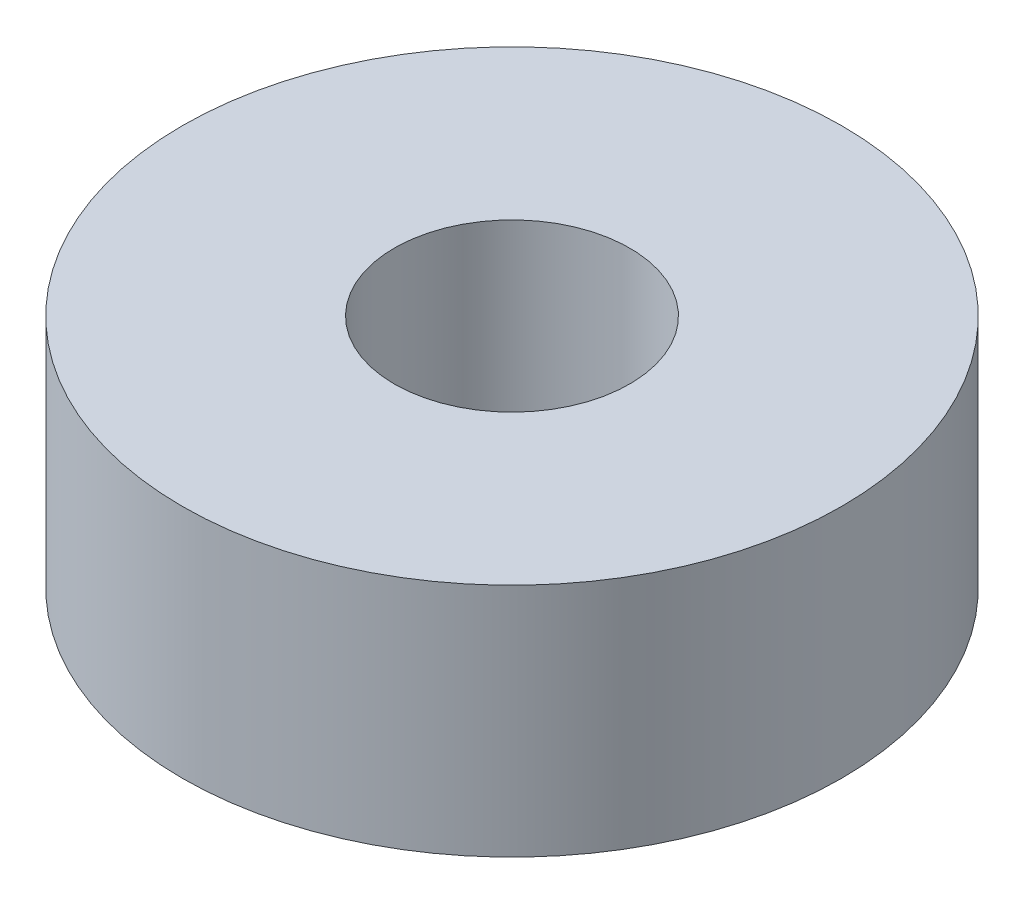
ISO-10303-21;
HEADER;
FILE_DESCRIPTION(('STEP AP214'),'2;1');
FILE_NAME('part.step','',(''),(''),'','','');
FILE_SCHEMA(('AUTOMOTIVE_DESIGN { 1 0 10303 214 1 1 1 1 }'));
ENDSEC;
DATA;
#1=APPLICATION_CONTEXT('core data for automotive mechanical design processes');
#2=APPLICATION_PROTOCOL_DEFINITION('international standard','automotive_design',2000,#1);
#3=PRODUCT_CONTEXT('',#1,'mechanical');
#4=PRODUCT('Part','Part','',(#3));
#5=PRODUCT_RELATED_PRODUCT_CATEGORY('part','',(#4));
#6=PRODUCT_DEFINITION_FORMATION('','',#4);
#7=PRODUCT_DEFINITION_CONTEXT('part definition',#1,'design');
#8=PRODUCT_DEFINITION('design','',#6,#7);
#9=PRODUCT_DEFINITION_SHAPE('','',#8);
#10=(LENGTH_UNIT() NAMED_UNIT(*) SI_UNIT(.MILLI.,.METRE.));
#11=(NAMED_UNIT(*) PLANE_ANGLE_UNIT() SI_UNIT($,.RADIAN.));
#12=(NAMED_UNIT(*) SI_UNIT($,.STERADIAN.) SOLID_ANGLE_UNIT());
#13=UNCERTAINTY_MEASURE_WITH_UNIT(LENGTH_MEASURE(1.E-05),#10,'distance_accuracy_value','');
#14=(GEOMETRIC_REPRESENTATION_CONTEXT(3) GLOBAL_UNCERTAINTY_ASSIGNED_CONTEXT((#13)) GLOBAL_UNIT_ASSIGNED_CONTEXT((#10,
#11,#12)) REPRESENTATION_CONTEXT('',''));
#15=CARTESIAN_POINT('',(0.,0.,0.));
#16=DIRECTION('',(0.,0.,1.));
#17=DIRECTION('',(1.,0.,0.));
#18=AXIS2_PLACEMENT_3D('',#15,#16,#17);
#19=CARTESIAN_POINT('',(0.,5.,0.));
#20=DIRECTION('',(0.,1.,0.));
#21=DIRECTION('',(0.,0.,1.));
#22=AXIS2_PLACEMENT_3D('',#19,#20,#21);
#23=PLANE('',#22);
#24=CARTESIAN_POINT('',(0.,5.,0.));
#25=DIRECTION('',(0.,1.,0.));
#26=DIRECTION('',(0.,0.,1.));
#27=AXIS2_PLACEMENT_3D('',#24,#25,#26);
#28=CIRCLE('',#27,7.);
#29=CARTESIAN_POINT('',(0.,5.,7.));
#30=VERTEX_POINT('',#29);
#31=EDGE_CURVE('E10',#30,#30,#28,.T.);
#32=ORIENTED_EDGE('',*,*,#31,.T.);
#33=EDGE_LOOP('',(#32));
#34=FACE_BOUND('',#33,.T.);
#35=CARTESIAN_POINT('',(0.,5.,0.));
#36=DIRECTION('',(0.,1.,0.));
#37=DIRECTION('',(0.,0.,1.));
#38=AXIS2_PLACEMENT_3D('',#35,#36,#37);
#39=CIRCLE('',#38,2.5);
#40=CARTESIAN_POINT('',(0.,5.,2.5));
#41=VERTEX_POINT('',#40);
#42=EDGE_CURVE('E50',#41,#41,#39,.T.);
#43=ORIENTED_EDGE('',*,*,#42,.F.);
#44=EDGE_LOOP('',(#43));
#45=FACE_BOUND('',#44,.T.);
#46=ADVANCED_FACE('F37',(#34,#45),#23,.T.);
#47=CARTESIAN_POINT('',(0.,0.,0.));
#48=DIRECTION('',(0.,1.,0.));
#49=DIRECTION('',(0.,0.,1.));
#50=AXIS2_PLACEMENT_3D('',#47,#48,#49);
#51=PLANE('',#50);
#52=CARTESIAN_POINT('',(0.,0.,0.));
#53=DIRECTION('',(0.,1.,0.));
#54=DIRECTION('',(0.,0.,1.));
#55=AXIS2_PLACEMENT_3D('',#52,#53,#54);
#56=CIRCLE('',#55,7.);
#57=CARTESIAN_POINT('',(0.,0.,7.));
#58=VERTEX_POINT('',#57);
#59=EDGE_CURVE('E41',#58,#58,#56,.T.);
#60=ORIENTED_EDGE('',*,*,#59,.F.);
#61=EDGE_LOOP('',(#60));
#62=FACE_BOUND('',#61,.T.);
#63=CARTESIAN_POINT('',(0.,0.,0.));
#64=DIRECTION('',(0.,1.,0.));
#65=DIRECTION('',(0.,0.,1.));
#66=AXIS2_PLACEMENT_3D('',#63,#64,#65);
#67=CIRCLE('',#66,2.5);
#68=CARTESIAN_POINT('',(0.,0.,2.5));
#69=VERTEX_POINT('',#68);
#70=EDGE_CURVE('E52',#69,#69,#67,.T.);
#71=ORIENTED_EDGE('',*,*,#70,.T.);
#72=EDGE_LOOP('',(#71));
#73=FACE_BOUND('',#72,.T.);
#74=ADVANCED_FACE('F64',(#62,#73),#51,.F.);
#75=CARTESIAN_POINT('',(0.,5.,0.));
#76=DIRECTION('',(0.,-1.,0.));
#77=DIRECTION('',(0.,0.,-1.));
#78=AXIS2_PLACEMENT_3D('',#75,#76,#77);
#79=CYLINDRICAL_SURFACE('',#78,7.);
#80=ORIENTED_EDGE('',*,*,#31,.F.);
#81=EDGE_LOOP('',(#80));
#82=FACE_BOUND('',#81,.T.);
#83=ORIENTED_EDGE('',*,*,#59,.T.);
#84=EDGE_LOOP('',(#83));
#85=FACE_BOUND('',#84,.T.);
#86=ADVANCED_FACE('F39',(#82,#85),#79,.T.);
#87=CARTESIAN_POINT('',(0.,5.,0.));
#88=DIRECTION('',(0.,-1.,0.));
#89=DIRECTION('',(0.,0.,-1.));
#90=AXIS2_PLACEMENT_3D('',#87,#88,#89);
#91=CYLINDRICAL_SURFACE('',#90,2.5);
#92=ORIENTED_EDGE('',*,*,#42,.T.);
#93=EDGE_LOOP('',(#92));
#94=FACE_BOUND('',#93,.T.);
#95=ORIENTED_EDGE('',*,*,#70,.F.);
#96=EDGE_LOOP('',(#95));
#97=FACE_BOUND('',#96,.T.);
#98=ADVANCED_FACE('F60',(#94,#97),#91,.F.);
#99=CLOSED_SHELL('',(#46,#74,#86,#98));
#100=MANIFOLD_SOLID_BREP('B2',#99);
#101=ADVANCED_BREP_SHAPE_REPRESENTATION('',(#18,#100),#14);
#102=SHAPE_DEFINITION_REPRESENTATION(#9,#101);
ENDSEC;
END-ISO-10303-21;
